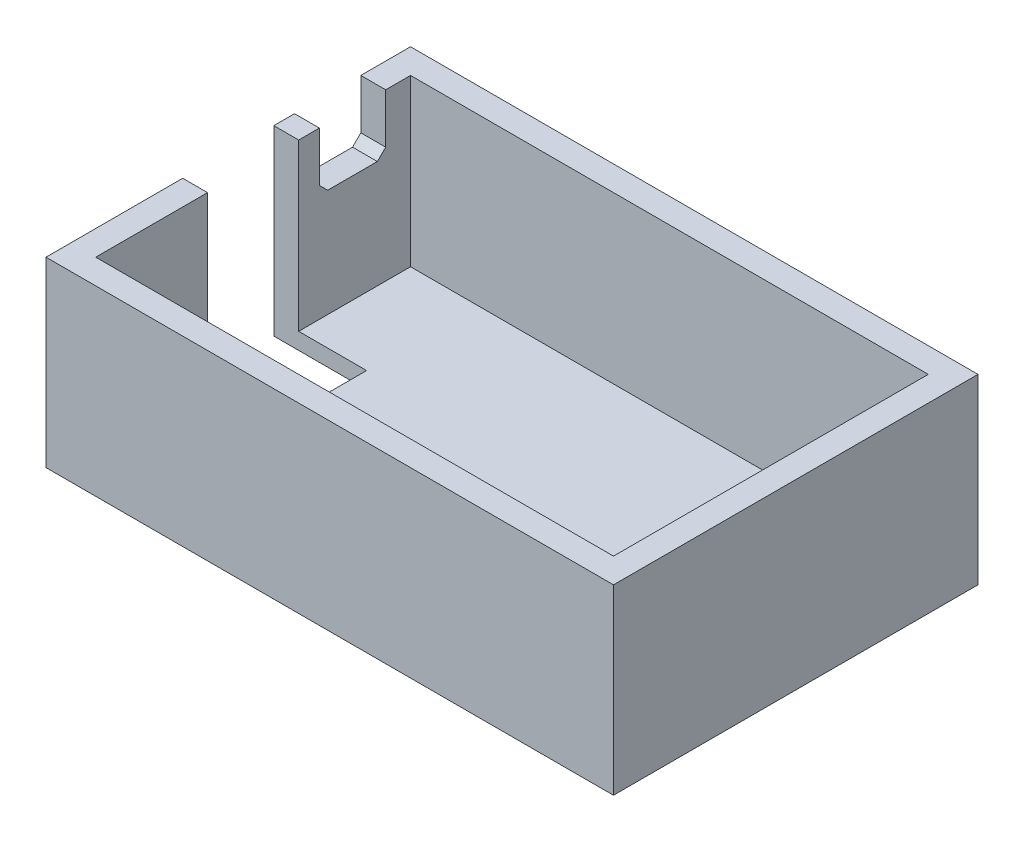
ISO-10303-21;
HEADER;
FILE_DESCRIPTION(('STEP AP214'),'2;1');
FILE_NAME('part.step','',(''),(''),'','','');
FILE_SCHEMA(('AUTOMOTIVE_DESIGN { 1 0 10303 214 1 1 1 1 }'));
ENDSEC;
DATA;
#1=APPLICATION_CONTEXT('core data for automotive mechanical design processes');
#2=APPLICATION_PROTOCOL_DEFINITION('international standard','automotive_design',2000,#1);
#3=PRODUCT_CONTEXT('',#1,'mechanical');
#4=PRODUCT('Part','Part','',(#3));
#5=PRODUCT_RELATED_PRODUCT_CATEGORY('part','',(#4));
#6=PRODUCT_DEFINITION_FORMATION('','',#4);
#7=PRODUCT_DEFINITION_CONTEXT('part definition',#1,'design');
#8=PRODUCT_DEFINITION('design','',#6,#7);
#9=PRODUCT_DEFINITION_SHAPE('','',#8);
#10=(LENGTH_UNIT() NAMED_UNIT(*) SI_UNIT(.MILLI.,.METRE.));
#11=(NAMED_UNIT(*) PLANE_ANGLE_UNIT() SI_UNIT($,.RADIAN.));
#12=(NAMED_UNIT(*) SI_UNIT($,.STERADIAN.) SOLID_ANGLE_UNIT());
#13=UNCERTAINTY_MEASURE_WITH_UNIT(LENGTH_MEASURE(1.E-05),#10,'distance_accuracy_value','');
#14=(GEOMETRIC_REPRESENTATION_CONTEXT(3) GLOBAL_UNCERTAINTY_ASSIGNED_CONTEXT((#13)) GLOBAL_UNIT_ASSIGNED_CONTEXT((#10,
#11,#12)) REPRESENTATION_CONTEXT('',''));
#15=CARTESIAN_POINT('',(0.,0.,0.));
#16=DIRECTION('',(0.,0.,1.));
#17=DIRECTION('',(1.,0.,0.));
#18=AXIS2_PLACEMENT_3D('',#15,#16,#17);
#19=CARTESIAN_POINT('',(0.,20.,0.));
#20=DIRECTION('',(0.,1.,0.));
#21=DIRECTION('',(0.,0.,1.));
#22=AXIS2_PLACEMENT_3D('',#19,#20,#21);
#23=PLANE('',#22);
#24=DIRECTION('',(-1.,0.,0.));
#25=VECTOR('',#24,1.);
#26=CARTESIAN_POINT('',(0.,20.,-7.1818181818182));
#27=LINE('',#26,#25);
#28=CARTESIAN_POINT('',(-33.2840909090909,20.,-7.18181818181819));
#29=VERTEX_POINT('',#28);
#30=CARTESIAN_POINT('',(-36.2840909090909,20.,-7.18181818181818));
#31=VERTEX_POINT('',#30);
#32=EDGE_CURVE('E172',#29,#31,#27,.T.);
#33=ORIENTED_EDGE('',*,*,#32,.F.);
#34=DIRECTION('',(0.,0.,-1.));
#35=VECTOR('',#34,1.);
#36=CARTESIAN_POINT('',(-33.2840909090909,20.,-10.1818181818182));
#37=LINE('',#36,#35);
#38=CARTESIAN_POINT('',(-33.2840909090909,20.,-10.1818181818182));
#39=VERTEX_POINT('',#38);
#40=EDGE_CURVE('E180',#29,#39,#37,.T.);
#41=ORIENTED_EDGE('',*,*,#40,.T.);
#42=DIRECTION('',(1.,0.,0.));
#43=VECTOR('',#42,1.);
#44=CARTESIAN_POINT('',(-33.2840909090909,20.,-10.1818181818182));
#45=LINE('',#44,#43);
#46=CARTESIAN_POINT('',(29.2159090909091,20.,-10.1818181818182));
#47=VERTEX_POINT('',#46);
#48=EDGE_CURVE('E196',#39,#47,#45,.T.);
#49=ORIENTED_EDGE('',*,*,#48,.T.);
#50=DIRECTION('',(0.,0.,1.));
#51=VECTOR('',#50,1.);
#52=CARTESIAN_POINT('',(29.2159090909091,20.,-10.1818181818182));
#53=LINE('',#52,#51);
#54=CARTESIAN_POINT('',(29.2159090909091,20.,27.8181818181818));
#55=VERTEX_POINT('',#54);
#56=EDGE_CURVE('E205',#47,#55,#53,.T.);
#57=ORIENTED_EDGE('',*,*,#56,.T.);
#58=DIRECTION('',(-1.,0.,0.));
#59=VECTOR('',#58,1.);
#60=CARTESIAN_POINT('',(-33.2840909090909,20.,27.8181818181818));
#61=LINE('',#60,#59);
#62=CARTESIAN_POINT('',(-33.2840909090909,20.,27.8181818181818));
#63=VERTEX_POINT('',#62);
#64=EDGE_CURVE('E207',#55,#63,#61,.T.);
#65=ORIENTED_EDGE('',*,*,#64,.T.);
#66=DIRECTION('',(0.,0.,-1.));
#67=VECTOR('',#66,1.);
#68=CARTESIAN_POINT('',(-33.2840909090909,20.,14.3181818181818));
#69=LINE('',#68,#67);
#70=CARTESIAN_POINT('',(-33.2840909090909,20.,14.3181818181818));
#71=VERTEX_POINT('',#70);
#72=EDGE_CURVE('E209',#63,#71,#69,.T.);
#73=ORIENTED_EDGE('',*,*,#72,.T.);
#74=DIRECTION('',(-1.,0.,0.));
#75=VECTOR('',#74,1.);
#76=CARTESIAN_POINT('',(-36.2840909090909,20.,14.3181818181818));
#77=LINE('',#76,#75);
#78=CARTESIAN_POINT('',(-36.2840909090909,20.,14.3181818181818));
#79=VERTEX_POINT('',#78);
#80=EDGE_CURVE('E211',#71,#79,#77,.T.);
#81=ORIENTED_EDGE('',*,*,#80,.T.);
#82=DIRECTION('',(0.,0.,1.));
#83=VECTOR('',#82,1.);
#84=CARTESIAN_POINT('',(-36.2840909090909,20.,14.3181818181818));
#85=LINE('',#84,#83);
#86=CARTESIAN_POINT('',(-36.2840909090909,20.,30.8181818181818));
#87=VERTEX_POINT('',#86);
#88=EDGE_CURVE('E213',#79,#87,#85,.T.);
#89=ORIENTED_EDGE('',*,*,#88,.T.);
#90=DIRECTION('',(1.,0.,0.));
#91=VECTOR('',#90,1.);
#92=CARTESIAN_POINT('',(-36.2840909090909,20.,30.8181818181818));
#93=LINE('',#92,#91);
#94=CARTESIAN_POINT('',(32.2159090909091,20.,30.8181818181818));
#95=VERTEX_POINT('',#94);
#96=EDGE_CURVE('E215',#87,#95,#93,.T.);
#97=ORIENTED_EDGE('',*,*,#96,.T.);
#98=DIRECTION('',(0.,0.,-1.));
#99=VECTOR('',#98,1.);
#100=CARTESIAN_POINT('',(32.2159090909091,20.,-13.1818181818182));
#101=LINE('',#100,#99);
#102=CARTESIAN_POINT('',(32.2159090909091,20.,-13.1818181818182));
#103=VERTEX_POINT('',#102);
#104=EDGE_CURVE('E217',#95,#103,#101,.T.);
#105=ORIENTED_EDGE('',*,*,#104,.T.);
#106=DIRECTION('',(-1.,0.,0.));
#107=VECTOR('',#106,1.);
#108=CARTESIAN_POINT('',(-36.2840909090909,20.,-13.1818181818182));
#109=LINE('',#108,#107);
#110=CARTESIAN_POINT('',(-36.2840909090909,20.,-13.1818181818182));
#111=VERTEX_POINT('',#110);
#112=EDGE_CURVE('E219',#103,#111,#109,.T.);
#113=ORIENTED_EDGE('',*,*,#112,.T.);
#114=DIRECTION('',(0.,0.,1.));
#115=VECTOR('',#114,1.);
#116=CARTESIAN_POINT('',(-36.2840909090909,20.,-13.1818181818182));
#117=LINE('',#116,#115);
#118=EDGE_CURVE('E183',#111,#31,#117,.T.);
#119=ORIENTED_EDGE('',*,*,#118,.T.);
#120=EDGE_LOOP('',(#33,#41,#49,#57,#65,#73,#81,#89,#97,#105,#113,#119));
#121=FACE_BOUND('',#120,.T.);
#122=ADVANCED_FACE('F33',(#121),#23,.T.);
#123=CARTESIAN_POINT('',(-36.2840909090909,20.,-13.1818181818182));
#124=DIRECTION('',(1.,0.,0.));
#125=DIRECTION('',(0.,0.,-1.));
#126=AXIS2_PLACEMENT_3D('',#123,#124,#125);
#127=PLANE('',#126);
#128=DIRECTION('',(0.,-1.,0.));
#129=VECTOR('',#128,1.);
#130=CARTESIAN_POINT('',(-36.2840909090909,20.,0.818181818181817));
#131=LINE('',#130,#129);
#132=CARTESIAN_POINT('',(-36.2840909090909,20.,0.818181818181815));
#133=VERTEX_POINT('',#132);
#134=CARTESIAN_POINT('',(-36.2840909090909,14.,0.818181818181816));
#135=VERTEX_POINT('',#134);
#136=EDGE_CURVE('E282',#133,#135,#131,.T.);
#137=ORIENTED_EDGE('',*,*,#136,.T.);
#138=DIRECTION('',(0.,0.707106781186543,0.707106781186552));
#139=VECTOR('',#138,1.);
#140=CARTESIAN_POINT('',(-36.2840909090909,9.99999999999996,-3.18181818181828));
#141=LINE('',#140,#139);
#142=CARTESIAN_POINT('',(-36.2840909090909,13.,-0.1818181818182));
#143=VERTEX_POINT('',#142);
#144=EDGE_CURVE('E274',#135,#143,#141,.F.);
#145=ORIENTED_EDGE('',*,*,#144,.T.);
#146=DIRECTION('',(0.,0.,-1.));
#147=VECTOR('',#146,1.);
#148=CARTESIAN_POINT('',(-36.2840909090909,13.,-13.1818181818182));
#149=LINE('',#148,#147);
#150=CARTESIAN_POINT('',(-36.2840909090909,13.,-6.18181818181819));
#151=VERTEX_POINT('',#150);
#152=EDGE_CURVE('E337',#143,#151,#149,.T.);
#153=ORIENTED_EDGE('',*,*,#152,.T.);
#154=DIRECTION('',(0.,-0.70710678118655,0.707106781186545));
#155=VECTOR('',#154,1.);
#156=CARTESIAN_POINT('',(-36.2840909090909,20.,-13.1818181818182));
#157=LINE('',#156,#155);
#158=CARTESIAN_POINT('',(-36.2840909090909,14.,-7.18181818181818));
#159=VERTEX_POINT('',#158);
#160=EDGE_CURVE('E11',#151,#159,#157,.F.);
#161=ORIENTED_EDGE('',*,*,#160,.T.);
#162=DIRECTION('',(0.,1.,0.));
#163=VECTOR('',#162,1.);
#164=CARTESIAN_POINT('',(-36.2840909090909,20.,-7.18181818181818));
#165=LINE('',#164,#163);
#166=EDGE_CURVE('E335',#159,#31,#165,.T.);
#167=ORIENTED_EDGE('',*,*,#166,.T.);
#168=ORIENTED_EDGE('',*,*,#118,.F.);
#169=DIRECTION('',(0.,-1.,0.));
#170=VECTOR('',#169,1.);
#171=CARTESIAN_POINT('',(-36.2840909090909,20.,-13.1818181818182));
#172=LINE('',#171,#170);
#173=CARTESIAN_POINT('',(-36.2840909090909,-2.,-13.1818181818182));
#174=VERTEX_POINT('',#173);
#175=EDGE_CURVE('E240',#111,#174,#172,.T.);
#176=ORIENTED_EDGE('',*,*,#175,.T.);
#177=DIRECTION('',(0.,0.,-1.));
#178=VECTOR('',#177,1.);
#179=CARTESIAN_POINT('',(-36.2840909090909,-2.,-13.1818181818182));
#180=LINE('',#179,#178);
#181=CARTESIAN_POINT('',(-36.2840909090909,-2.,3.31818181818182));
#182=VERTEX_POINT('',#181);
#183=EDGE_CURVE('E324',#182,#174,#180,.T.);
#184=ORIENTED_EDGE('',*,*,#183,.F.);
#185=DIRECTION('',(0.,-1.,0.));
#186=VECTOR('',#185,1.);
#187=CARTESIAN_POINT('',(-36.2840909090909,20.,3.31818181818182));
#188=LINE('',#187,#186);
#189=CARTESIAN_POINT('',(-36.2840909090909,20.,3.31818181818182));
#190=VERTEX_POINT('',#189);
#191=EDGE_CURVE('E238',#190,#182,#188,.T.);
#192=ORIENTED_EDGE('',*,*,#191,.F.);
#193=EDGE_CURVE('E221',#133,#190,#117,.T.);
#194=ORIENTED_EDGE('',*,*,#193,.F.);
#195=EDGE_LOOP('',(#137,#145,#153,#161,#167,#168,#176,#184,#192,#194));
#196=FACE_BOUND('',#195,.T.);
#197=ADVANCED_FACE('F292',(#196),#127,.F.);
#198=CARTESIAN_POINT('',(-33.2840909090909,20.,-10.1818181818182));
#199=DIRECTION('',(-1.,0.,0.));
#200=DIRECTION('',(0.,0.,1.));
#201=AXIS2_PLACEMENT_3D('',#198,#199,#200);
#202=PLANE('',#201);
#203=ORIENTED_EDGE('',*,*,#40,.F.);
#204=DIRECTION('',(0.,1.,0.));
#205=VECTOR('',#204,1.);
#206=CARTESIAN_POINT('',(-33.2840909090909,20.,-7.18181818181819));
#207=LINE('',#206,#205);
#208=CARTESIAN_POINT('',(-33.2840909090909,14.,-7.18181818181819));
#209=VERTEX_POINT('',#208);
#210=EDGE_CURVE('E169',#209,#29,#207,.T.);
#211=ORIENTED_EDGE('',*,*,#210,.F.);
#212=DIRECTION('',(0.,0.70710678118655,-0.707106781186545));
#213=VECTOR('',#212,1.);
#214=CARTESIAN_POINT('',(-33.2840909090909,18.5,-11.6818181818182));
#215=LINE('',#214,#213);
#216=CARTESIAN_POINT('',(-33.2840909090909,13.,-6.18181818181819));
#217=VERTEX_POINT('',#216);
#218=EDGE_CURVE('E41',#209,#217,#215,.F.);
#219=ORIENTED_EDGE('',*,*,#218,.T.);
#220=DIRECTION('',(0.,0.,-1.));
#221=VECTOR('',#220,1.);
#222=CARTESIAN_POINT('',(-33.2840909090909,13.,-7.18181818181819));
#223=LINE('',#222,#221);
#224=CARTESIAN_POINT('',(-33.2840909090909,13.,-0.181818181818201));
#225=VERTEX_POINT('',#224);
#226=EDGE_CURVE('E277',#225,#217,#223,.T.);
#227=ORIENTED_EDGE('',*,*,#226,.F.);
#228=DIRECTION('',(0.,-0.707106781186543,-0.707106781186552));
#229=VECTOR('',#228,1.);
#230=CARTESIAN_POINT('',(-33.2840909090909,11.5,-1.68181818181826));
#231=LINE('',#230,#229);
#232=CARTESIAN_POINT('',(-33.2840909090909,14.,0.818181818181814));
#233=VERTEX_POINT('',#232);
#234=EDGE_CURVE('E272',#225,#233,#231,.F.);
#235=ORIENTED_EDGE('',*,*,#234,.T.);
#236=DIRECTION('',(0.,-1.,0.));
#237=VECTOR('',#236,1.);
#238=CARTESIAN_POINT('',(-33.2840909090909,20.,0.818181818181815));
#239=LINE('',#238,#237);
#240=CARTESIAN_POINT('',(-33.2840909090909,20.,0.818181818181815));
#241=VERTEX_POINT('',#240);
#242=EDGE_CURVE('E177',#241,#233,#239,.T.);
#243=ORIENTED_EDGE('',*,*,#242,.F.);
#244=CARTESIAN_POINT('',(-33.2840909090909,20.,3.31818181818182));
#245=VERTEX_POINT('',#244);
#246=EDGE_CURVE('E192',#245,#241,#37,.T.);
#247=ORIENTED_EDGE('',*,*,#246,.F.);
#248=DIRECTION('',(0.,-1.,0.));
#249=VECTOR('',#248,1.);
#250=CARTESIAN_POINT('',(-33.2840909090909,20.,3.31818181818182));
#251=LINE('',#250,#249);
#252=CARTESIAN_POINT('',(-33.2840909090909,0.,3.31818181818182));
#253=VERTEX_POINT('',#252);
#254=EDGE_CURVE('E225',#245,#253,#251,.T.);
#255=ORIENTED_EDGE('',*,*,#254,.T.);
#256=DIRECTION('',(0.,0.,-1.));
#257=VECTOR('',#256,1.);
#258=CARTESIAN_POINT('',(-33.2840909090909,0.,-10.1818181818182));
#259=LINE('',#258,#257);
#260=CARTESIAN_POINT('',(-33.2840909090909,0.,-10.1818181818182));
#261=VERTEX_POINT('',#260);
#262=EDGE_CURVE('E226',#253,#261,#259,.T.);
#263=ORIENTED_EDGE('',*,*,#262,.T.);
#264=DIRECTION('',(0.,-1.,0.));
#265=VECTOR('',#264,1.);
#266=CARTESIAN_POINT('',(-33.2840909090909,20.,-10.1818181818182));
#267=LINE('',#266,#265);
#268=EDGE_CURVE('E191',#39,#261,#267,.T.);
#269=ORIENTED_EDGE('',*,*,#268,.F.);
#270=EDGE_LOOP('',(#203,#211,#219,#227,#235,#243,#247,#255,#263,#269));
#271=FACE_BOUND('',#270,.T.);
#272=ADVANCED_FACE('F188',(#271),#202,.F.);
#273=CARTESIAN_POINT('',(-33.2840909090909,20.,-10.1818181818182));
#274=DIRECTION('',(0.,0.,-1.));
#275=DIRECTION('',(-1.,0.,0.));
#276=AXIS2_PLACEMENT_3D('',#273,#274,#275);
#277=PLANE('',#276);
#278=DIRECTION('',(1.,0.,0.));
#279=VECTOR('',#278,1.);
#280=CARTESIAN_POINT('',(-33.2840909090909,0.,-10.1818181818182));
#281=LINE('',#280,#279);
#282=CARTESIAN_POINT('',(29.2159090909091,0.,-10.1818181818182));
#283=VERTEX_POINT('',#282);
#284=EDGE_CURVE('E228',#261,#283,#281,.T.);
#285=ORIENTED_EDGE('',*,*,#284,.T.);
#286=DIRECTION('',(0.,-1.,0.));
#287=VECTOR('',#286,1.);
#288=CARTESIAN_POINT('',(29.2159090909091,20.,-10.1818181818182));
#289=LINE('',#288,#287);
#290=EDGE_CURVE('E260',#47,#283,#289,.T.);
#291=ORIENTED_EDGE('',*,*,#290,.F.);
#292=ORIENTED_EDGE('',*,*,#48,.F.);
#293=ORIENTED_EDGE('',*,*,#268,.T.);
#294=EDGE_LOOP('',(#285,#291,#292,#293));
#295=FACE_BOUND('',#294,.T.);
#296=ADVANCED_FACE('F387',(#295),#277,.F.);
#297=CARTESIAN_POINT('',(29.2159090909091,20.,-10.1818181818182));
#298=DIRECTION('',(1.,0.,0.));
#299=DIRECTION('',(0.,0.,-1.));
#300=AXIS2_PLACEMENT_3D('',#297,#298,#299);
#301=PLANE('',#300);
#302=DIRECTION('',(0.,0.,1.));
#303=VECTOR('',#302,1.);
#304=CARTESIAN_POINT('',(29.2159090909091,0.,-10.1818181818182));
#305=LINE('',#304,#303);
#306=CARTESIAN_POINT('',(29.2159090909091,0.,27.8181818181818));
#307=VERTEX_POINT('',#306);
#308=EDGE_CURVE('E231',#283,#307,#305,.T.);
#309=ORIENTED_EDGE('',*,*,#308,.T.);
#310=DIRECTION('',(0.,-1.,0.));
#311=VECTOR('',#310,1.);
#312=CARTESIAN_POINT('',(29.2159090909091,20.,27.8181818181818));
#313=LINE('',#312,#311);
#314=EDGE_CURVE('E257',#55,#307,#313,.T.);
#315=ORIENTED_EDGE('',*,*,#314,.F.);
#316=ORIENTED_EDGE('',*,*,#56,.F.);
#317=ORIENTED_EDGE('',*,*,#290,.T.);
#318=EDGE_LOOP('',(#309,#315,#316,#317));
#319=FACE_BOUND('',#318,.T.);
#320=ADVANCED_FACE('F393',(#319),#301,.F.);
#321=CARTESIAN_POINT('',(-33.2840909090909,20.,27.8181818181818));
#322=DIRECTION('',(0.,0.,1.));
#323=DIRECTION('',(1.,0.,0.));
#324=AXIS2_PLACEMENT_3D('',#321,#322,#323);
#325=PLANE('',#324);
#326=DIRECTION('',(-1.,0.,0.));
#327=VECTOR('',#326,1.);
#328=CARTESIAN_POINT('',(-33.2840909090909,0.,27.8181818181818));
#329=LINE('',#328,#327);
#330=CARTESIAN_POINT('',(-33.2840909090909,0.,27.8181818181818));
#331=VERTEX_POINT('',#330);
#332=EDGE_CURVE('E198',#307,#331,#329,.T.);
#333=ORIENTED_EDGE('',*,*,#332,.T.);
#334=DIRECTION('',(0.,-1.,0.));
#335=VECTOR('',#334,1.);
#336=CARTESIAN_POINT('',(-33.2840909090909,20.,27.8181818181818));
#337=LINE('',#336,#335);
#338=EDGE_CURVE('E254',#63,#331,#337,.T.);
#339=ORIENTED_EDGE('',*,*,#338,.F.);
#340=ORIENTED_EDGE('',*,*,#64,.F.);
#341=ORIENTED_EDGE('',*,*,#314,.T.);
#342=EDGE_LOOP('',(#333,#339,#340,#341));
#343=FACE_BOUND('',#342,.T.);
#344=ADVANCED_FACE('F395',(#343),#325,.F.);
#345=CARTESIAN_POINT('',(-33.2840909090909,20.,14.3181818181818));
#346=DIRECTION('',(-1.,0.,0.));
#347=DIRECTION('',(0.,0.,1.));
#348=AXIS2_PLACEMENT_3D('',#345,#346,#347);
#349=PLANE('',#348);
#350=DIRECTION('',(0.,0.,-1.));
#351=VECTOR('',#350,1.);
#352=CARTESIAN_POINT('',(-33.2840909090909,0.,14.3181818181818));
#353=LINE('',#352,#351);
#354=CARTESIAN_POINT('',(-33.2840909090909,0.,14.3181818181818));
#355=VERTEX_POINT('',#354);
#356=EDGE_CURVE('E193',#331,#355,#353,.T.);
#357=ORIENTED_EDGE('',*,*,#356,.T.);
#358=DIRECTION('',(0.,-1.,0.));
#359=VECTOR('',#358,1.);
#360=CARTESIAN_POINT('',(-33.2840909090909,20.,14.3181818181818));
#361=LINE('',#360,#359);
#362=EDGE_CURVE('E251',#71,#355,#361,.T.);
#363=ORIENTED_EDGE('',*,*,#362,.F.);
#364=ORIENTED_EDGE('',*,*,#72,.F.);
#365=ORIENTED_EDGE('',*,*,#338,.T.);
#366=EDGE_LOOP('',(#357,#363,#364,#365));
#367=FACE_BOUND('',#366,.T.);
#368=ADVANCED_FACE('F399',(#367),#349,.F.);
#369=CARTESIAN_POINT('',(-36.2840909090909,20.,14.3181818181818));
#370=DIRECTION('',(0.,0.,1.));
#371=DIRECTION('',(1.,0.,0.));
#372=AXIS2_PLACEMENT_3D('',#369,#370,#371);
#373=PLANE('',#372);
#374=ORIENTED_EDGE('',*,*,#362,.T.);
#375=DIRECTION('',(-1.,0.,0.));
#376=VECTOR('',#375,1.);
#377=CARTESIAN_POINT('',(-25.0840909090909,0.,14.3181818181818));
#378=LINE('',#377,#376);
#379=CARTESIAN_POINT('',(-25.0840909090909,0.,14.3181818181818));
#380=VERTEX_POINT('',#379);
#381=EDGE_CURVE('E352',#380,#355,#378,.T.);
#382=ORIENTED_EDGE('',*,*,#381,.F.);
#383=DIRECTION('',(0.,1.,0.));
#384=VECTOR('',#383,1.);
#385=CARTESIAN_POINT('',(-25.0840909090909,0.,14.3181818181818));
#386=LINE('',#385,#384);
#387=CARTESIAN_POINT('',(-25.0840909090909,-2.,14.3181818181818));
#388=VERTEX_POINT('',#387);
#389=EDGE_CURVE('E344',#388,#380,#386,.T.);
#390=ORIENTED_EDGE('',*,*,#389,.F.);
#391=DIRECTION('',(-1.,0.,0.));
#392=VECTOR('',#391,1.);
#393=CARTESIAN_POINT('',(-25.0840909090909,-2.,14.3181818181818));
#394=LINE('',#393,#392);
#395=CARTESIAN_POINT('',(-36.2840909090909,-2.,14.3181818181818));
#396=VERTEX_POINT('',#395);
#397=EDGE_CURVE('E354',#388,#396,#394,.T.);
#398=ORIENTED_EDGE('',*,*,#397,.T.);
#399=DIRECTION('',(0.,-1.,0.));
#400=VECTOR('',#399,1.);
#401=CARTESIAN_POINT('',(-36.2840909090909,20.,14.3181818181818));
#402=LINE('',#401,#400);
#403=EDGE_CURVE('E249',#79,#396,#402,.T.);
#404=ORIENTED_EDGE('',*,*,#403,.F.);
#405=ORIENTED_EDGE('',*,*,#80,.F.);
#406=EDGE_LOOP('',(#374,#382,#390,#398,#404,#405));
#407=FACE_BOUND('',#406,.T.);
#408=ADVANCED_FACE('F381',(#407),#373,.F.);
#409=CARTESIAN_POINT('',(-36.2840909090909,20.,30.8181818181818));
#410=DIRECTION('',(0.,0.,-1.));
#411=DIRECTION('',(-1.,0.,0.));
#412=AXIS2_PLACEMENT_3D('',#409,#410,#411);
#413=PLANE('',#412);
#414=DIRECTION('',(0.,-1.,0.));
#415=VECTOR('',#414,1.);
#416=CARTESIAN_POINT('',(-36.2840909090909,20.,30.8181818181818));
#417=LINE('',#416,#415);
#418=CARTESIAN_POINT('',(-36.2840909090909,-2.,30.8181818181818));
#419=VERTEX_POINT('',#418);
#420=EDGE_CURVE('E247',#87,#419,#417,.T.);
#421=ORIENTED_EDGE('',*,*,#420,.T.);
#422=DIRECTION('',(-1.,0.,0.));
#423=VECTOR('',#422,1.);
#424=CARTESIAN_POINT('',(-36.2840909090909,-2.,30.8181818181818));
#425=LINE('',#424,#423);
#426=CARTESIAN_POINT('',(32.2159090909091,-2.,30.8181818181818));
#427=VERTEX_POINT('',#426);
#428=EDGE_CURVE('E202',#427,#419,#425,.T.);
#429=ORIENTED_EDGE('',*,*,#428,.F.);
#430=DIRECTION('',(0.,-1.,0.));
#431=VECTOR('',#430,1.);
#432=CARTESIAN_POINT('',(32.2159090909091,20.,30.8181818181818));
#433=LINE('',#432,#431);
#434=EDGE_CURVE('E245',#95,#427,#433,.T.);
#435=ORIENTED_EDGE('',*,*,#434,.F.);
#436=ORIENTED_EDGE('',*,*,#96,.F.);
#437=EDGE_LOOP('',(#421,#429,#435,#436));
#438=FACE_BOUND('',#437,.T.);
#439=ADVANCED_FACE('F402',(#438),#413,.F.);
#440=CARTESIAN_POINT('',(32.2159090909091,20.,-13.1818181818182));
#441=DIRECTION('',(-1.,0.,0.));
#442=DIRECTION('',(0.,0.,1.));
#443=AXIS2_PLACEMENT_3D('',#440,#441,#442);
#444=PLANE('',#443);
#445=ORIENTED_EDGE('',*,*,#434,.T.);
#446=DIRECTION('',(0.,0.,1.));
#447=VECTOR('',#446,1.);
#448=CARTESIAN_POINT('',(32.2159090909091,-2.,-13.1818181818182));
#449=LINE('',#448,#447);
#450=CARTESIAN_POINT('',(32.2159090909091,-2.,-13.1818181818182));
#451=VERTEX_POINT('',#450);
#452=EDGE_CURVE('E363',#451,#427,#449,.T.);
#453=ORIENTED_EDGE('',*,*,#452,.F.);
#454=DIRECTION('',(0.,-1.,0.));
#455=VECTOR('',#454,1.);
#456=CARTESIAN_POINT('',(32.2159090909091,20.,-13.1818181818182));
#457=LINE('',#456,#455);
#458=EDGE_CURVE('E243',#103,#451,#457,.T.);
#459=ORIENTED_EDGE('',*,*,#458,.F.);
#460=ORIENTED_EDGE('',*,*,#104,.F.);
#461=EDGE_LOOP('',(#445,#453,#459,#460));
#462=FACE_BOUND('',#461,.T.);
#463=ADVANCED_FACE('F404',(#462),#444,.F.);
#464=CARTESIAN_POINT('',(-36.2840909090909,20.,-13.1818181818182));
#465=DIRECTION('',(0.,0.,1.));
#466=DIRECTION('',(1.,0.,0.));
#467=AXIS2_PLACEMENT_3D('',#464,#465,#466);
#468=PLANE('',#467);
#469=ORIENTED_EDGE('',*,*,#458,.T.);
#470=DIRECTION('',(1.,0.,0.));
#471=VECTOR('',#470,1.);
#472=CARTESIAN_POINT('',(-36.2840909090909,-2.,-13.1818181818182));
#473=LINE('',#472,#471);
#474=EDGE_CURVE('E361',#174,#451,#473,.T.);
#475=ORIENTED_EDGE('',*,*,#474,.F.);
#476=ORIENTED_EDGE('',*,*,#175,.F.);
#477=ORIENTED_EDGE('',*,*,#112,.F.);
#478=EDGE_LOOP('',(#469,#475,#476,#477));
#479=FACE_BOUND('',#478,.T.);
#480=ADVANCED_FACE('F409',(#479),#468,.F.);
#481=ORIENTED_EDGE('',*,*,#403,.T.);
#482=EDGE_CURVE('E358',#419,#396,#180,.T.);
#483=ORIENTED_EDGE('',*,*,#482,.F.);
#484=ORIENTED_EDGE('',*,*,#420,.F.);
#485=ORIENTED_EDGE('',*,*,#88,.F.);
#486=EDGE_LOOP('',(#481,#483,#484,#485));
#487=FACE_BOUND('',#486,.T.);
#488=ADVANCED_FACE('F299',(#487),#127,.F.);
#489=CARTESIAN_POINT('',(-36.2840909090909,20.,3.31818181818182));
#490=DIRECTION('',(0.,0.,-1.));
#491=DIRECTION('',(-1.,0.,0.));
#492=AXIS2_PLACEMENT_3D('',#489,#490,#491);
#493=PLANE('',#492);
#494=ORIENTED_EDGE('',*,*,#191,.T.);
#495=DIRECTION('',(-1.,0.,0.));
#496=VECTOR('',#495,1.);
#497=CARTESIAN_POINT('',(-25.0840909090909,-2.,3.31818181818182));
#498=LINE('',#497,#496);
#499=CARTESIAN_POINT('',(-25.0840909090909,-2.,3.31818181818182));
#500=VERTEX_POINT('',#499);
#501=EDGE_CURVE('E350',#500,#182,#498,.T.);
#502=ORIENTED_EDGE('',*,*,#501,.F.);
#503=DIRECTION('',(0.,-1.,0.));
#504=VECTOR('',#503,1.);
#505=CARTESIAN_POINT('',(-25.0840909090909,0.,3.31818181818182));
#506=LINE('',#505,#504);
#507=CARTESIAN_POINT('',(-25.0840909090909,0.,3.31818181818182));
#508=VERTEX_POINT('',#507);
#509=EDGE_CURVE('E339',#508,#500,#506,.T.);
#510=ORIENTED_EDGE('',*,*,#509,.F.);
#511=DIRECTION('',(-1.,0.,0.));
#512=VECTOR('',#511,1.);
#513=CARTESIAN_POINT('',(-25.0840909090909,0.,3.31818181818182));
#514=LINE('',#513,#512);
#515=EDGE_CURVE('E329',#508,#253,#514,.T.);
#516=ORIENTED_EDGE('',*,*,#515,.T.);
#517=ORIENTED_EDGE('',*,*,#254,.F.);
#518=DIRECTION('',(1.,0.,0.));
#519=VECTOR('',#518,1.);
#520=CARTESIAN_POINT('',(-36.2840909090909,20.,3.31818181818182));
#521=LINE('',#520,#519);
#522=EDGE_CURVE('E223',#190,#245,#521,.T.);
#523=ORIENTED_EDGE('',*,*,#522,.F.);
#524=EDGE_LOOP('',(#494,#502,#510,#516,#517,#523));
#525=FACE_BOUND('',#524,.T.);
#526=ADVANCED_FACE('F304',(#525),#493,.F.);
#527=DIRECTION('',(1.,0.,0.));
#528=VECTOR('',#527,1.);
#529=CARTESIAN_POINT('',(0.,20.,0.818181818181798));
#530=LINE('',#529,#528);
#531=EDGE_CURVE('E185',#133,#241,#530,.T.);
#532=ORIENTED_EDGE('',*,*,#531,.F.);
#533=ORIENTED_EDGE('',*,*,#193,.T.);
#534=ORIENTED_EDGE('',*,*,#522,.T.);
#535=ORIENTED_EDGE('',*,*,#246,.T.);
#536=EDGE_LOOP('',(#532,#533,#534,#535));
#537=FACE_BOUND('',#536,.T.);
#538=ADVANCED_FACE('F294',(#537),#23,.T.);
#539=CARTESIAN_POINT('',(0.,0.,0.));
#540=DIRECTION('',(0.,1.,0.));
#541=DIRECTION('',(0.,0.,1.));
#542=AXIS2_PLACEMENT_3D('',#539,#540,#541);
#543=PLANE('',#542);
#544=ORIENTED_EDGE('',*,*,#515,.F.);
#545=DIRECTION('',(0.,0.,-1.));
#546=VECTOR('',#545,1.);
#547=CARTESIAN_POINT('',(-25.0840909090909,0.,3.31818181818182));
#548=LINE('',#547,#546);
#549=EDGE_CURVE('E347',#380,#508,#548,.T.);
#550=ORIENTED_EDGE('',*,*,#549,.F.);
#551=ORIENTED_EDGE('',*,*,#381,.T.);
#552=ORIENTED_EDGE('',*,*,#356,.F.);
#553=ORIENTED_EDGE('',*,*,#332,.F.);
#554=ORIENTED_EDGE('',*,*,#308,.F.);
#555=ORIENTED_EDGE('',*,*,#284,.F.);
#556=ORIENTED_EDGE('',*,*,#262,.F.);
#557=EDGE_LOOP('',(#544,#550,#551,#552,#553,#554,#555,#556));
#558=FACE_BOUND('',#557,.T.);
#559=ADVANCED_FACE('F303',(#558),#543,.T.);
#560=CARTESIAN_POINT('',(0.,-2.,0.));
#561=DIRECTION('',(0.,1.,0.));
#562=DIRECTION('',(0.,0.,1.));
#563=AXIS2_PLACEMENT_3D('',#560,#561,#562);
#564=PLANE('',#563);
#565=DIRECTION('',(0.,0.,1.));
#566=VECTOR('',#565,1.);
#567=CARTESIAN_POINT('',(-25.0840909090909,-2.,3.31818181818182));
#568=LINE('',#567,#566);
#569=EDGE_CURVE('E341',#500,#388,#568,.T.);
#570=ORIENTED_EDGE('',*,*,#569,.F.);
#571=ORIENTED_EDGE('',*,*,#501,.T.);
#572=ORIENTED_EDGE('',*,*,#183,.T.);
#573=ORIENTED_EDGE('',*,*,#474,.T.);
#574=ORIENTED_EDGE('',*,*,#452,.T.);
#575=ORIENTED_EDGE('',*,*,#428,.T.);
#576=ORIENTED_EDGE('',*,*,#482,.T.);
#577=ORIENTED_EDGE('',*,*,#397,.F.);
#578=EDGE_LOOP('',(#570,#571,#572,#573,#574,#575,#576,#577));
#579=FACE_BOUND('',#578,.T.);
#580=ADVANCED_FACE('F310',(#579),#564,.F.);
#581=CARTESIAN_POINT('',(-25.0840909090909,0.,0.));
#582=DIRECTION('',(-1.,0.,0.));
#583=DIRECTION('',(0.,0.,1.));
#584=AXIS2_PLACEMENT_3D('',#581,#582,#583);
#585=PLANE('',#584);
#586=ORIENTED_EDGE('',*,*,#509,.T.);
#587=ORIENTED_EDGE('',*,*,#569,.T.);
#588=ORIENTED_EDGE('',*,*,#389,.T.);
#589=ORIENTED_EDGE('',*,*,#549,.T.);
#590=EDGE_LOOP('',(#586,#587,#588,#589));
#591=FACE_BOUND('',#590,.T.);
#592=ADVANCED_FACE('F383',(#591),#585,.T.);
#593=CARTESIAN_POINT('',(-43.2840909090909,13.,-7.18181818181818));
#594=DIRECTION('',(0.,-1.,0.));
#595=DIRECTION('',(0.,0.,-1.));
#596=AXIS2_PLACEMENT_3D('',#593,#594,#595);
#597=PLANE('',#596);
#598=ORIENTED_EDGE('',*,*,#152,.F.);
#599=DIRECTION('',(1.,0.,0.));
#600=VECTOR('',#599,1.);
#601=CARTESIAN_POINT('',(-33.2840909090909,13.,-0.1818181818182));
#602=LINE('',#601,#600);
#603=EDGE_CURVE('E266',#143,#225,#602,.T.);
#604=ORIENTED_EDGE('',*,*,#603,.T.);
#605=ORIENTED_EDGE('',*,*,#226,.T.);
#606=DIRECTION('',(-1.,0.,0.));
#607=VECTOR('',#606,1.);
#608=CARTESIAN_POINT('',(-36.2840909090909,13.,-6.18181818181819));
#609=LINE('',#608,#607);
#610=EDGE_CURVE('E184',#217,#151,#609,.T.);
#611=ORIENTED_EDGE('',*,*,#610,.T.);
#612=EDGE_LOOP('',(#598,#604,#605,#611));
#613=FACE_BOUND('',#612,.T.);
#614=ADVANCED_FACE('F280',(#613),#597,.F.);
#615=CARTESIAN_POINT('',(-43.2840909090909,20.,-7.18181818181818));
#616=DIRECTION('',(0.,0.,-1.));
#617=DIRECTION('',(-1.,0.,0.));
#618=AXIS2_PLACEMENT_3D('',#615,#616,#617);
#619=PLANE('',#618);
#620=ORIENTED_EDGE('',*,*,#166,.F.);
#621=DIRECTION('',(1.,0.,0.));
#622=VECTOR('',#621,1.);
#623=CARTESIAN_POINT('',(-33.2840909090909,14.,-7.18181818181819));
#624=LINE('',#623,#622);
#625=EDGE_CURVE('E174',#159,#209,#624,.T.);
#626=ORIENTED_EDGE('',*,*,#625,.T.);
#627=ORIENTED_EDGE('',*,*,#210,.T.);
#628=ORIENTED_EDGE('',*,*,#32,.T.);
#629=EDGE_LOOP('',(#620,#626,#627,#628));
#630=FACE_BOUND('',#629,.T.);
#631=ADVANCED_FACE('F171',(#630),#619,.F.);
#632=CARTESIAN_POINT('',(-43.2840909090909,20.,0.81818181818182));
#633=DIRECTION('',(0.,0.,1.));
#634=DIRECTION('',(1.,0.,0.));
#635=AXIS2_PLACEMENT_3D('',#632,#633,#634);
#636=PLANE('',#635);
#637=ORIENTED_EDGE('',*,*,#242,.T.);
#638=DIRECTION('',(-1.,0.,0.));
#639=VECTOR('',#638,1.);
#640=CARTESIAN_POINT('',(-36.2840909090909,14.,0.818181818181816));
#641=LINE('',#640,#639);
#642=EDGE_CURVE('E269',#233,#135,#641,.T.);
#643=ORIENTED_EDGE('',*,*,#642,.T.);
#644=ORIENTED_EDGE('',*,*,#136,.F.);
#645=ORIENTED_EDGE('',*,*,#531,.T.);
#646=EDGE_LOOP('',(#637,#643,#644,#645));
#647=FACE_BOUND('',#646,.T.);
#648=ADVANCED_FACE('F289',(#647),#636,.F.);
#649=CARTESIAN_POINT('',(-43.2840909090909,13.,-0.181818181818195));
#650=DIRECTION('',(0.,0.707106781186552,-0.707106781186543));
#651=DIRECTION('',(-1.,0.,0.));
#652=AXIS2_PLACEMENT_3D('',#649,#650,#651);
#653=PLANE('',#652);
#654=ORIENTED_EDGE('',*,*,#144,.F.);
#655=ORIENTED_EDGE('',*,*,#642,.F.);
#656=ORIENTED_EDGE('',*,*,#234,.F.);
#657=ORIENTED_EDGE('',*,*,#603,.F.);
#658=EDGE_LOOP('',(#654,#655,#656,#657));
#659=FACE_BOUND('',#658,.T.);
#660=ADVANCED_FACE('F285',(#659),#653,.T.);
#661=CARTESIAN_POINT('',(-43.2840909090909,14.,-7.18181818181818));
#662=DIRECTION('',(0.,0.707106781186545,0.70710678118655));
#663=DIRECTION('',(-1.,0.,0.));
#664=AXIS2_PLACEMENT_3D('',#661,#662,#663);
#665=PLANE('',#664);
#666=ORIENTED_EDGE('',*,*,#160,.F.);
#667=ORIENTED_EDGE('',*,*,#610,.F.);
#668=ORIENTED_EDGE('',*,*,#218,.F.);
#669=ORIENTED_EDGE('',*,*,#625,.F.);
#670=EDGE_LOOP('',(#666,#667,#668,#669));
#671=FACE_BOUND('',#670,.T.);
#672=ADVANCED_FACE('F35',(#671),#665,.T.);
#673=CLOSED_SHELL('',(#122,#197,#272,#296,#320,#344,#368,#408,#439,#463,#480,#488,#526,#538,
#559,#580,#592,#614,#631,#648,#660,#672));
#674=MANIFOLD_SOLID_BREP('B2',#673);
#675=ADVANCED_BREP_SHAPE_REPRESENTATION('',(#18,#674),#14);
#676=SHAPE_DEFINITION_REPRESENTATION(#9,#675);
ENDSEC;
END-ISO-10303-21;
